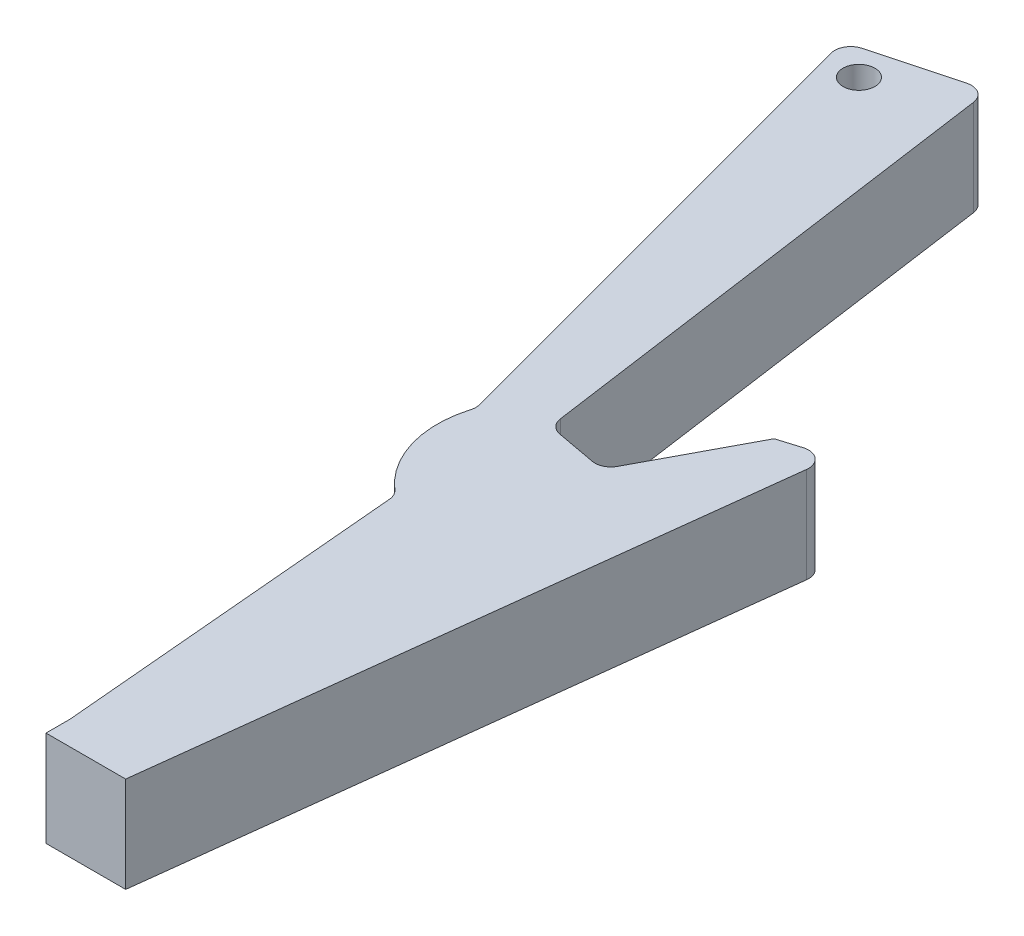
ISO-10303-21;
HEADER;
FILE_DESCRIPTION(('STEP AP214'),'2;1');
FILE_NAME('part.step','',(''),(''),'','','');
FILE_SCHEMA(('AUTOMOTIVE_DESIGN { 1 0 10303 214 1 1 1 1 }'));
ENDSEC;
DATA;
#1=APPLICATION_CONTEXT('core data for automotive mechanical design processes');
#2=APPLICATION_PROTOCOL_DEFINITION('international standard','automotive_design',2000,#1);
#3=PRODUCT_CONTEXT('',#1,'mechanical');
#4=PRODUCT('Part','Part','',(#3));
#5=PRODUCT_RELATED_PRODUCT_CATEGORY('part','',(#4));
#6=PRODUCT_DEFINITION_FORMATION('','',#4);
#7=PRODUCT_DEFINITION_CONTEXT('part definition',#1,'design');
#8=PRODUCT_DEFINITION('design','',#6,#7);
#9=PRODUCT_DEFINITION_SHAPE('','',#8);
#10=(LENGTH_UNIT() NAMED_UNIT(*) SI_UNIT(.MILLI.,.METRE.));
#11=(NAMED_UNIT(*) PLANE_ANGLE_UNIT() SI_UNIT($,.RADIAN.));
#12=(NAMED_UNIT(*) SI_UNIT($,.STERADIAN.) SOLID_ANGLE_UNIT());
#13=UNCERTAINTY_MEASURE_WITH_UNIT(LENGTH_MEASURE(1.E-05),#10,'distance_accuracy_value','');
#14=(GEOMETRIC_REPRESENTATION_CONTEXT(3) GLOBAL_UNCERTAINTY_ASSIGNED_CONTEXT((#13)) GLOBAL_UNIT_ASSIGNED_CONTEXT((#10,
#11,#12)) REPRESENTATION_CONTEXT('',''));
#15=CARTESIAN_POINT('',(0.,0.,0.));
#16=DIRECTION('',(0.,0.,1.));
#17=DIRECTION('',(1.,0.,0.));
#18=AXIS2_PLACEMENT_3D('',#15,#16,#17);
#19=CARTESIAN_POINT('',(-2.65349144547683,12.,-44.5765718956175));
#20=DIRECTION('',(-0.99026806874157,0.,0.13917310096007));
#21=DIRECTION('',(0.13917310096007,0.,0.99026806874157));
#22=AXIS2_PLACEMENT_3D('',#19,#20,#21);
#23=PLANE('',#22);
#24=DIRECTION('',(-0.13917310096007,0.,-0.99026806874157));
#25=VECTOR('',#24,1.);
#26=CARTESIAN_POINT('',(-2.65349144547683,12.,-44.5765718956175));
#27=LINE('',#26,#25);
#28=CARTESIAN_POINT('',(6.1405419291194,12.,17.9962269156188));
#29=VERTEX_POINT('',#28);
#30=CARTESIAN_POINT('',(-2.33887829598138,12.,-42.3379830174337));
#31=VERTEX_POINT('',#30);
#32=EDGE_CURVE('E265',#29,#31,#27,.T.);
#33=ORIENTED_EDGE('',*,*,#32,.F.);
#34=DIRECTION('',(0.,-1.,0.));
#35=VECTOR('',#34,1.);
#36=CARTESIAN_POINT('',(6.1405419291194,0.,17.9962269156188));
#37=LINE('',#36,#35);
#38=CARTESIAN_POINT('',(6.1405419291194,0.,17.9962269156188));
#39=VERTEX_POINT('',#38);
#40=EDGE_CURVE('E294',#29,#39,#37,.T.);
#41=ORIENTED_EDGE('',*,*,#40,.T.);
#42=DIRECTION('',(-0.13917310096007,0.,-0.99026806874157));
#43=VECTOR('',#42,1.);
#44=CARTESIAN_POINT('',(-2.65349144547683,0.,-44.5765718956175));
#45=LINE('',#44,#43);
#46=CARTESIAN_POINT('',(-2.33887829598138,0.,-42.3379830174337));
#47=VERTEX_POINT('',#46);
#48=EDGE_CURVE('E226',#39,#47,#45,.T.);
#49=ORIENTED_EDGE('',*,*,#48,.T.);
#50=DIRECTION('',(0.,-1.,0.));
#51=VECTOR('',#50,1.);
#52=CARTESIAN_POINT('',(-2.33887829598138,12.,-42.3379830174337));
#53=LINE('',#52,#51);
#54=EDGE_CURVE('E291',#47,#31,#53,.F.);
#55=ORIENTED_EDGE('',*,*,#54,.T.);
#56=EDGE_LOOP('',(#33,#41,#49,#55));
#57=FACE_BOUND('',#56,.T.);
#58=ADVANCED_FACE('F49',(#57),#23,.F.);
#59=CARTESIAN_POINT('',(-2.65349144547683,12.,-44.5765718956175));
#60=DIRECTION('',(0.258819045102521,0.,0.965925826289068));
#61=DIRECTION('',(0.965925826289068,0.,-0.258819045102521));
#62=AXIS2_PLACEMENT_3D('',#59,#60,#61);
#63=PLANE('',#62);
#64=DIRECTION('',(-0.965925826289068,0.,0.258819045102521));
#65=VECTOR('',#64,1.);
#66=CARTESIAN_POINT('',(-2.65349144547683,12.,-44.5765718956175));
#67=LINE('',#66,#65);
#68=CARTESIAN_POINT('',(-4.83705252366957,12.,-43.9914884680917));
#69=VERTEX_POINT('',#68);
#70=CARTESIAN_POINT('',(-15.2105271872347,12.,-41.2119243092847));
#71=VERTEX_POINT('',#70);
#72=EDGE_CURVE('E382',#69,#71,#67,.T.);
#73=ORIENTED_EDGE('',*,*,#72,.F.);
#74=DIRECTION('',(0.,-1.,0.));
#75=VECTOR('',#74,1.);
#76=CARTESIAN_POINT('',(-4.83705252366957,12.,-43.9914884680917));
#77=LINE('',#76,#75);
#78=CARTESIAN_POINT('',(-4.83705252366957,0.,-43.9914884680917));
#79=VERTEX_POINT('',#78);
#80=EDGE_CURVE('E334',#69,#79,#77,.T.);
#81=ORIENTED_EDGE('',*,*,#80,.T.);
#82=DIRECTION('',(-0.965925826289068,0.,0.258819045102521));
#83=VECTOR('',#82,1.);
#84=CARTESIAN_POINT('',(-2.65349144547683,0.,-44.5765718956175));
#85=LINE('',#84,#83);
#86=CARTESIAN_POINT('',(-15.2105271872347,0.,-41.2119243092847));
#87=VERTEX_POINT('',#86);
#88=EDGE_CURVE('E230',#79,#87,#85,.T.);
#89=ORIENTED_EDGE('',*,*,#88,.T.);
#90=DIRECTION('',(0.,-1.,0.));
#91=VECTOR('',#90,1.);
#92=CARTESIAN_POINT('',(-15.2105271872347,12.,-41.2119243092847));
#93=LINE('',#92,#91);
#94=EDGE_CURVE('E65',#87,#71,#93,.F.);
#95=ORIENTED_EDGE('',*,*,#94,.T.);
#96=EDGE_LOOP('',(#73,#81,#89,#95));
#97=FACE_BOUND('',#96,.T.);
#98=ADVANCED_FACE('F427',(#97),#63,.F.);
#99=CARTESIAN_POINT('',(-17.1423788398128,12.,-40.6942862190796));
#100=DIRECTION('',(0.965925826289067,0.,-0.258819045102525));
#101=DIRECTION('',(-0.258819045102525,0.,-0.965925826289067));
#102=AXIS2_PLACEMENT_3D('',#99,#100,#101);
#103=PLANE('',#102);
#104=DIRECTION('',(0.258819045102525,0.,0.965925826289067));
#105=VECTOR('',#104,1.);
#106=CARTESIAN_POINT('',(-17.1423788398128,0.,-40.6942862190796));
#107=LINE('',#106,#105);
#108=CARTESIAN_POINT('',(-16.6247407496078,0.,-38.7624345665015));
#109=VERTEX_POINT('',#108);
#110=CARTESIAN_POINT('',(-0.470359644799433,0.,21.5265364814728));
#111=VERTEX_POINT('',#110);
#112=EDGE_CURVE('E234',#109,#111,#107,.T.);
#113=ORIENTED_EDGE('',*,*,#112,.T.);
#114=DIRECTION('',(0.,1.,0.));
#115=VECTOR('',#114,1.);
#116=CARTESIAN_POINT('',(-0.470359644799428,12.,21.5265364814729));
#117=LINE('',#116,#115);
#118=CARTESIAN_POINT('',(-0.470359644799433,12.,21.5265364814728));
#119=VERTEX_POINT('',#118);
#120=EDGE_CURVE('E288',#111,#119,#117,.T.);
#121=ORIENTED_EDGE('',*,*,#120,.T.);
#122=DIRECTION('',(0.258819045102525,0.,0.965925826289067));
#123=VECTOR('',#122,1.);
#124=CARTESIAN_POINT('',(-17.1423788398128,12.,-40.6942862190796));
#125=LINE('',#124,#123);
#126=CARTESIAN_POINT('',(-16.6247407496078,12.,-38.7624345665015));
#127=VERTEX_POINT('',#126);
#128=EDGE_CURVE('E385',#127,#119,#125,.T.);
#129=ORIENTED_EDGE('',*,*,#128,.F.);
#130=DIRECTION('',(0.,-1.,0.));
#131=VECTOR('',#130,1.);
#132=CARTESIAN_POINT('',(-16.6247407496078,12.,-38.7624345665015));
#133=LINE('',#132,#131);
#134=EDGE_CURVE('E284',#127,#109,#133,.T.);
#135=ORIENTED_EDGE('',*,*,#134,.T.);
#136=EDGE_LOOP('',(#113,#121,#129,#135));
#137=FACE_BOUND('',#136,.T.);
#138=ADVANCED_FACE('F432',(#137),#103,.F.);
#139=CARTESIAN_POINT('',(11.9864841455349,12.,26.2827407739579));
#140=DIRECTION('',(0.,-1.,0.));
#141=DIRECTION('',(0.,0.,-1.));
#142=AXIS2_PLACEMENT_3D('',#139,#140,#141);
#143=CYLINDRICAL_SURFACE('',#142,13.);
#144=CARTESIAN_POINT('',(11.9864841455349,0.,26.2827407739579));
#145=DIRECTION('',(0.,1.,0.));
#146=DIRECTION('',(0.,0.,1.));
#147=AXIS2_PLACEMENT_3D('',#144,#145,#146);
#148=CIRCLE('',#147,13.);
#149=CARTESIAN_POINT('',(-0.483718571655904,0.,22.6093167319819));
#150=VERTEX_POINT('',#149);
#151=CARTESIAN_POINT('',(3.47033842210722,0.,36.104922915282));
#152=VERTEX_POINT('',#151);
#153=EDGE_CURVE('E238',#150,#152,#148,.T.);
#154=ORIENTED_EDGE('',*,*,#153,.T.);
#155=DIRECTION('',(0.,-1.,0.));
#156=VECTOR('',#155,1.);
#157=CARTESIAN_POINT('',(3.47033842210722,12.,36.104922915282));
#158=LINE('',#157,#156);
#159=CARTESIAN_POINT('',(3.47033842210722,12.,36.104922915282));
#160=VERTEX_POINT('',#159);
#161=EDGE_CURVE('E281',#152,#160,#158,.F.);
#162=ORIENTED_EDGE('',*,*,#161,.T.);
#163=CARTESIAN_POINT('',(11.9864841455349,12.,26.2827407739579));
#164=DIRECTION('',(0.,1.,0.));
#165=DIRECTION('',(0.,0.,1.));
#166=AXIS2_PLACEMENT_3D('',#163,#164,#165);
#167=CIRCLE('',#166,13.);
#168=CARTESIAN_POINT('',(-0.483718571655904,12.,22.6093167319819));
#169=VERTEX_POINT('',#168);
#170=EDGE_CURVE('E188',#169,#160,#167,.T.);
#171=ORIENTED_EDGE('',*,*,#170,.F.);
#172=DIRECTION('',(0.,-1.,0.));
#173=VECTOR('',#172,1.);
#174=CARTESIAN_POINT('',(-0.483718571655906,12.,22.6093167319819));
#175=LINE('',#174,#173);
#176=EDGE_CURVE('E277',#169,#150,#175,.T.);
#177=ORIENTED_EDGE('',*,*,#176,.T.);
#178=EDGE_LOOP('',(#154,#162,#171,#177));
#179=FACE_BOUND('',#178,.T.);
#180=ADVANCED_FACE('F463',(#179),#143,.T.);
#181=CARTESIAN_POINT('',(8.01379514327857,12.,81.4286873610854));
#182=DIRECTION('',(0.996169325772287,0.,-0.0874452651113049));
#183=DIRECTION('',(-0.0874452651113049,0.,-0.996169325772288));
#184=AXIS2_PLACEMENT_3D('',#181,#182,#183);
#185=PLANE('',#184);
#186=DIRECTION('',(0.0874452651113049,0.,0.996169325772287));
#187=VECTOR('',#186,1.);
#188=CARTESIAN_POINT('',(8.01379514327857,12.,81.4286873610854));
#189=LINE('',#188,#187);
#190=CARTESIAN_POINT('',(4.15250080850908,12.,37.4411373298784));
#191=VERTEX_POINT('',#190);
#192=CARTESIAN_POINT('',(8.01379514327857,12.,81.4286873610854));
#193=VERTEX_POINT('',#192);
#194=EDGE_CURVE('E174',#191,#193,#189,.T.);
#195=ORIENTED_EDGE('',*,*,#194,.F.);
#196=DIRECTION('',(0.,1.,0.));
#197=VECTOR('',#196,1.);
#198=CARTESIAN_POINT('',(4.15250080850908,0.,37.4411373298784));
#199=LINE('',#198,#197);
#200=CARTESIAN_POINT('',(4.15250080850908,0.,37.4411373298784));
#201=VERTEX_POINT('',#200);
#202=EDGE_CURVE('E198',#191,#201,#199,.F.);
#203=ORIENTED_EDGE('',*,*,#202,.T.);
#204=DIRECTION('',(0.0874452651113049,0.,0.996169325772287));
#205=VECTOR('',#204,1.);
#206=CARTESIAN_POINT('',(8.01379514327857,0.,81.4286873610854));
#207=LINE('',#206,#205);
#208=CARTESIAN_POINT('',(8.01379514327857,0.,81.4286873610854));
#209=VERTEX_POINT('',#208);
#210=EDGE_CURVE('E194',#201,#209,#207,.T.);
#211=ORIENTED_EDGE('',*,*,#210,.T.);
#212=DIRECTION('',(0.,-1.,0.));
#213=VECTOR('',#212,1.);
#214=CARTESIAN_POINT('',(8.01379514327857,12.,81.4286873610854));
#215=LINE('',#214,#213);
#216=EDGE_CURVE('E191',#193,#209,#215,.T.);
#217=ORIENTED_EDGE('',*,*,#216,.F.);
#218=EDGE_LOOP('',(#195,#203,#211,#217));
#219=FACE_BOUND('',#218,.T.);
#220=ADVANCED_FACE('F192',(#219),#185,.F.);
#221=CARTESIAN_POINT('',(8.01379514327857,12.,84.4286873610854));
#222=DIRECTION('',(1.,0.,0.));
#223=DIRECTION('',(0.,0.,-1.));
#224=AXIS2_PLACEMENT_3D('',#221,#222,#223);
#225=PLANE('',#224);
#226=DIRECTION('',(0.,0.,1.));
#227=VECTOR('',#226,1.);
#228=CARTESIAN_POINT('',(8.01379514327857,0.,84.4286873610854));
#229=LINE('',#228,#227);
#230=CARTESIAN_POINT('',(8.01379514327857,0.,84.4286873610854));
#231=VERTEX_POINT('',#230);
#232=EDGE_CURVE('E244',#209,#231,#229,.T.);
#233=ORIENTED_EDGE('',*,*,#232,.T.);
#234=DIRECTION('',(0.,-1.,0.));
#235=VECTOR('',#234,1.);
#236=CARTESIAN_POINT('',(8.01379514327857,12.,84.4286873610854));
#237=LINE('',#236,#235);
#238=CARTESIAN_POINT('',(8.01379514327857,12.,84.4286873610854));
#239=VERTEX_POINT('',#238);
#240=EDGE_CURVE('E199',#239,#231,#237,.T.);
#241=ORIENTED_EDGE('',*,*,#240,.F.);
#242=DIRECTION('',(0.,0.,1.));
#243=VECTOR('',#242,1.);
#244=CARTESIAN_POINT('',(8.01379514327857,12.,84.4286873610854));
#245=LINE('',#244,#243);
#246=EDGE_CURVE('E179',#193,#239,#245,.T.);
#247=ORIENTED_EDGE('',*,*,#246,.F.);
#248=ORIENTED_EDGE('',*,*,#216,.T.);
#249=EDGE_LOOP('',(#233,#241,#247,#248));
#250=FACE_BOUND('',#249,.T.);
#251=ADVANCED_FACE('F201',(#250),#225,.F.);
#252=CARTESIAN_POINT('',(18.0137951432786,12.,84.4286873610854));
#253=DIRECTION('',(0.,0.,-1.));
#254=DIRECTION('',(-1.,0.,0.));
#255=AXIS2_PLACEMENT_3D('',#252,#253,#254);
#256=PLANE('',#255);
#257=DIRECTION('',(1.,0.,0.));
#258=VECTOR('',#257,1.);
#259=CARTESIAN_POINT('',(18.0137951432786,0.,84.4286873610854));
#260=LINE('',#259,#258);
#261=CARTESIAN_POINT('',(18.0137951432786,0.,84.4286873610854));
#262=VERTEX_POINT('',#261);
#263=EDGE_CURVE('E247',#231,#262,#260,.T.);
#264=ORIENTED_EDGE('',*,*,#263,.T.);
#265=DIRECTION('',(0.,-1.,0.));
#266=VECTOR('',#265,1.);
#267=CARTESIAN_POINT('',(18.0137951432786,12.,84.4286873610854));
#268=LINE('',#267,#266);
#269=CARTESIAN_POINT('',(18.0137951432786,12.,84.4286873610854));
#270=VERTEX_POINT('',#269);
#271=EDGE_CURVE('E269',#270,#262,#268,.T.);
#272=ORIENTED_EDGE('',*,*,#271,.F.);
#273=DIRECTION('',(1.,0.,0.));
#274=VECTOR('',#273,1.);
#275=CARTESIAN_POINT('',(18.0137951432786,12.,84.4286873610854));
#276=LINE('',#275,#274);
#277=EDGE_CURVE('E205',#239,#270,#276,.T.);
#278=ORIENTED_EDGE('',*,*,#277,.F.);
#279=ORIENTED_EDGE('',*,*,#240,.T.);
#280=EDGE_LOOP('',(#264,#272,#278,#279));
#281=FACE_BOUND('',#280,.T.);
#282=ADVANCED_FACE('F405',(#281),#256,.F.);
#283=CARTESIAN_POINT('',(27.4517414412394,12.,4.98735574034277));
#284=DIRECTION('',(-0.993016645259283,0.,-0.11797432872451));
#285=DIRECTION('',(-0.11797432872451,0.,0.993016645259283));
#286=AXIS2_PLACEMENT_3D('',#283,#284,#285);
#287=PLANE('',#286);
#288=DIRECTION('',(0.11797432872451,0.,-0.993016645259283));
#289=VECTOR('',#288,1.);
#290=CARTESIAN_POINT('',(27.4517414412394,0.,4.98735574034277));
#291=LINE('',#290,#289);
#292=CARTESIAN_POINT('',(27.0898145393669,0.,8.03377644739096));
#293=VERTEX_POINT('',#292);
#294=EDGE_CURVE('E250',#262,#293,#291,.T.);
#295=ORIENTED_EDGE('',*,*,#294,.T.);
#296=DIRECTION('',(0.,-1.,0.));
#297=VECTOR('',#296,1.);
#298=CARTESIAN_POINT('',(27.0898145393669,12.,8.03377644739096));
#299=LINE('',#298,#297);
#300=CARTESIAN_POINT('',(27.0898145393669,12.,8.03377644739096));
#301=VERTEX_POINT('',#300);
#302=EDGE_CURVE('E321',#293,#301,#299,.F.);
#303=ORIENTED_EDGE('',*,*,#302,.T.);
#304=DIRECTION('',(0.11797432872451,0.,-0.993016645259283));
#305=VECTOR('',#304,1.);
#306=CARTESIAN_POINT('',(27.4517414412394,12.,4.98735574034277));
#307=LINE('',#306,#305);
#308=EDGE_CURVE('E208',#270,#301,#307,.T.);
#309=ORIENTED_EDGE('',*,*,#308,.F.);
#310=ORIENTED_EDGE('',*,*,#271,.T.);
#311=EDGE_LOOP('',(#295,#303,#309,#310));
#312=FACE_BOUND('',#311,.T.);
#313=ADVANCED_FACE('F417',(#312),#287,.F.);
#314=CARTESIAN_POINT('',(21.7145942594851,12.,6.74381303128064));
#315=DIRECTION('',(0.292742881822979,0.,0.956191196959048));
#316=DIRECTION('',(0.956191196959048,0.,-0.292742881822979));
#317=AXIS2_PLACEMENT_3D('',#314,#315,#316);
#318=PLANE('',#317);
#319=DIRECTION('',(-0.956191196959048,0.,0.292742881822979));
#320=VECTOR('',#319,1.);
#321=CARTESIAN_POINT('',(21.7145942594851,12.,6.74381303128064));
#322=LINE('',#321,#320);
#323=CARTESIAN_POINT('',(24.5182954852024,12.,5.88544539602384));
#324=VERTEX_POINT('',#323);
#325=CARTESIAN_POINT('',(21.7145942594851,12.,6.74381303128064));
#326=VERTEX_POINT('',#325);
#327=EDGE_CURVE('E214',#324,#326,#322,.T.);
#328=ORIENTED_EDGE('',*,*,#327,.F.);
#329=DIRECTION('',(0.,-1.,0.));
#330=VECTOR('',#329,1.);
#331=CARTESIAN_POINT('',(24.5182954852024,12.,5.88544539602384));
#332=LINE('',#331,#330);
#333=CARTESIAN_POINT('',(24.5182954852024,0.,5.88544539602384));
#334=VERTEX_POINT('',#333);
#335=EDGE_CURVE('E308',#324,#334,#332,.T.);
#336=ORIENTED_EDGE('',*,*,#335,.T.);
#337=DIRECTION('',(-0.956191196959048,0.,0.292742881822979));
#338=VECTOR('',#337,1.);
#339=CARTESIAN_POINT('',(21.7145942594851,0.,6.74381303128064));
#340=LINE('',#339,#338);
#341=CARTESIAN_POINT('',(21.7145942594851,0.,6.74381303128064));
#342=VERTEX_POINT('',#341);
#343=EDGE_CURVE('E254',#334,#342,#340,.T.);
#344=ORIENTED_EDGE('',*,*,#343,.T.);
#345=DIRECTION('',(0.,-1.,0.));
#346=VECTOR('',#345,1.);
#347=CARTESIAN_POINT('',(21.7145942594851,12.,6.74381303128064));
#348=LINE('',#347,#346);
#349=EDGE_CURVE('E225',#326,#342,#348,.T.);
#350=ORIENTED_EDGE('',*,*,#349,.F.);
#351=EDGE_LOOP('',(#328,#336,#344,#350));
#352=FACE_BOUND('',#351,.T.);
#353=ADVANCED_FACE('F416',(#352),#318,.F.);
#354=CARTESIAN_POINT('',(14.2085334178928,12.,20.8738891330685));
#355=DIRECTION('',(0.883129756361739,0.,0.469128802599515));
#356=DIRECTION('',(0.469128802599515,0.,-0.88312975636174));
#357=AXIS2_PLACEMENT_3D('',#354,#355,#356);
#358=PLANE('',#357);
#359=DIRECTION('',(-0.469128802599515,0.,0.883129756361739));
#360=VECTOR('',#359,1.);
#361=CARTESIAN_POINT('',(14.2085334178928,0.,20.8738891330685));
#362=LINE('',#361,#360);
#363=CARTESIAN_POINT('',(14.8960917627071,0.,19.5795681914087));
#364=VERTEX_POINT('',#363);
#365=EDGE_CURVE('E257',#342,#364,#362,.T.);
#366=ORIENTED_EDGE('',*,*,#365,.T.);
#367=DIRECTION('',(0.,-1.,0.));
#368=VECTOR('',#367,1.);
#369=CARTESIAN_POINT('',(14.8960917627071,12.,19.5795681914087));
#370=LINE('',#369,#368);
#371=CARTESIAN_POINT('',(14.8960917627071,12.,19.5795681914087));
#372=VERTEX_POINT('',#371);
#373=EDGE_CURVE('E305',#364,#372,#370,.F.);
#374=ORIENTED_EDGE('',*,*,#373,.T.);
#375=DIRECTION('',(-0.469128802599515,0.,0.883129756361739));
#376=VECTOR('',#375,1.);
#377=CARTESIAN_POINT('',(14.2085334178928,12.,20.8738891330685));
#378=LINE('',#377,#376);
#379=EDGE_CURVE('E217',#326,#372,#378,.T.);
#380=ORIENTED_EDGE('',*,*,#379,.F.);
#381=ORIENTED_EDGE('',*,*,#349,.T.);
#382=EDGE_LOOP('',(#366,#374,#380,#381));
#383=FACE_BOUND('',#382,.T.);
#384=ADVANCED_FACE('F364',(#383),#358,.F.);
#385=CARTESIAN_POINT('',(6.3411219754765,12.,19.4234281043825));
#386=DIRECTION('',(-0.181307628585742,0.,0.983426430302041));
#387=DIRECTION('',(0.983426430302041,0.,0.181307628585742));
#388=AXIS2_PLACEMENT_3D('',#385,#386,#387);
#389=PLANE('',#388);
#390=DIRECTION('',(-0.983426430302041,0.,-0.181307628585742));
#391=VECTOR('',#390,1.);
#392=CARTESIAN_POINT('',(6.3411219754765,0.,19.4234281043825));
#393=LINE('',#392,#391);
#394=CARTESIAN_POINT('',(12.7672169928122,0.,20.6081634468137));
#395=VERTEX_POINT('',#394);
#396=CARTESIAN_POINT('',(7.75846280943105,0.,19.6847335743028));
#397=VERTEX_POINT('',#396);
#398=EDGE_CURVE('E261',#395,#397,#393,.T.);
#399=ORIENTED_EDGE('',*,*,#398,.T.);
#400=DIRECTION('',(0.,-1.,0.));
#401=VECTOR('',#400,1.);
#402=CARTESIAN_POINT('',(7.75846280943105,12.,19.6847335743028));
#403=LINE('',#402,#401);
#404=CARTESIAN_POINT('',(7.75846280943105,12.,19.6847335743028));
#405=VERTEX_POINT('',#404);
#406=EDGE_CURVE('E302',#397,#405,#403,.F.);
#407=ORIENTED_EDGE('',*,*,#406,.T.);
#408=DIRECTION('',(-0.983426430302041,0.,-0.181307628585742));
#409=VECTOR('',#408,1.);
#410=CARTESIAN_POINT('',(6.3411219754765,12.,19.4234281043825));
#411=LINE('',#410,#409);
#412=CARTESIAN_POINT('',(12.7672169928122,12.,20.6081634468137));
#413=VERTEX_POINT('',#412);
#414=EDGE_CURVE('E221',#413,#405,#411,.T.);
#415=ORIENTED_EDGE('',*,*,#414,.F.);
#416=DIRECTION('',(0.,-1.,0.));
#417=VECTOR('',#416,1.);
#418=CARTESIAN_POINT('',(12.7672169928122,0.,20.6081634468137));
#419=LINE('',#418,#417);
#420=EDGE_CURVE('E298',#413,#395,#419,.T.);
#421=ORIENTED_EDGE('',*,*,#420,.T.);
#422=EDGE_LOOP('',(#399,#407,#415,#421));
#423=FACE_BOUND('',#422,.T.);
#424=ADVANCED_FACE('F372',(#423),#389,.F.);
#425=CARTESIAN_POINT('',(11.9864841455349,12.,26.2827407739579));
#426=DIRECTION('',(0.,1.,0.));
#427=DIRECTION('',(0.,0.,1.));
#428=AXIS2_PLACEMENT_3D('',#425,#426,#427);
#429=PLANE('',#428);
#430=CARTESIAN_POINT('',(-12.2433993542465,12.,-37.8658590943335));
#431=DIRECTION('',(0.,1.,0.));
#432=DIRECTION('',(0.,0.,1.));
#433=AXIS2_PLACEMENT_3D('',#430,#431,#432);
#434=CIRCLE('',#433,2.);
#435=CARTESIAN_POINT('',(-12.2433993542465,12.,-35.8658590943335));
#436=VERTEX_POINT('',#435);
#437=EDGE_CURVE('E388',#436,#436,#434,.T.);
#438=ORIENTED_EDGE('',*,*,#437,.F.);
#439=EDGE_LOOP('',(#438));
#440=FACE_BOUND('',#439,.T.);
#441=ORIENTED_EDGE('',*,*,#308,.T.);
#442=CARTESIAN_POINT('',(25.1037812488484,12.,7.79782778994194));
#443=DIRECTION('',(0.,1.,0.));
#444=DIRECTION('',(0.,0.,1.));
#445=AXIS2_PLACEMENT_3D('',#442,#443,#444);
#446=CIRCLE('',#445,2.);
#447=EDGE_CURVE('E329',#301,#324,#446,.T.);
#448=ORIENTED_EDGE('',*,*,#447,.T.);
#449=ORIENTED_EDGE('',*,*,#327,.T.);
#450=ORIENTED_EDGE('',*,*,#379,.T.);
#451=CARTESIAN_POINT('',(13.1298322499837,12.,18.6413105862097));
#452=DIRECTION('',(0.,1.,0.));
#453=DIRECTION('',(0.,0.,1.));
#454=AXIS2_PLACEMENT_3D('',#451,#452,#453);
#455=CIRCLE('',#454,2.);
#456=EDGE_CURVE('E11',#372,#413,#455,.F.);
#457=ORIENTED_EDGE('',*,*,#456,.T.);
#458=ORIENTED_EDGE('',*,*,#414,.T.);
#459=CARTESIAN_POINT('',(8.12107806660253,12.,17.7178807136987));
#460=DIRECTION('',(0.,1.,0.));
#461=DIRECTION('',(0.,0.,1.));
#462=AXIS2_PLACEMENT_3D('',#459,#460,#461);
#463=CIRCLE('',#462,2.);
#464=EDGE_CURVE('E352',#405,#29,#463,.F.);
#465=ORIENTED_EDGE('',*,*,#464,.T.);
#466=ORIENTED_EDGE('',*,*,#32,.T.);
#467=CARTESIAN_POINT('',(-4.31941443346452,12.,-42.0596368155135));
#468=DIRECTION('',(0.,1.,0.));
#469=DIRECTION('',(0.,0.,1.));
#470=AXIS2_PLACEMENT_3D('',#467,#468,#469);
#471=CIRCLE('',#470,2.);
#472=EDGE_CURVE('E72',#31,#69,#471,.T.);
#473=ORIENTED_EDGE('',*,*,#472,.T.);
#474=ORIENTED_EDGE('',*,*,#72,.T.);
#475=CARTESIAN_POINT('',(-14.6928890970297,12.,-39.2800726567066));
#476=DIRECTION('',(0.,1.,0.));
#477=DIRECTION('',(0.,0.,1.));
#478=AXIS2_PLACEMENT_3D('',#475,#476,#477);
#479=CIRCLE('',#478,2.);
#480=EDGE_CURVE('E324',#71,#127,#479,.T.);
#481=ORIENTED_EDGE('',*,*,#480,.T.);
#482=ORIENTED_EDGE('',*,*,#128,.T.);
#483=CARTESIAN_POINT('',(-2.40221129737757,12.,22.0441745716779));
#484=DIRECTION('',(0.,1.,0.));
#485=DIRECTION('',(0.,0.,1.));
#486=AXIS2_PLACEMENT_3D('',#483,#484,#485);
#487=CIRCLE('',#486,2.);
#488=EDGE_CURVE('E346',#119,#169,#487,.F.);
#489=ORIENTED_EDGE('',*,*,#488,.T.);
#490=ORIENTED_EDGE('',*,*,#170,.T.);
#491=CARTESIAN_POINT('',(2.1601621569645,12.,37.616027860101));
#492=DIRECTION('',(0.,1.,0.));
#493=DIRECTION('',(0.,0.,1.));
#494=AXIS2_PLACEMENT_3D('',#491,#492,#493);
#495=CIRCLE('',#494,2.);
#496=EDGE_CURVE('E183',#160,#191,#495,.F.);
#497=ORIENTED_EDGE('',*,*,#496,.T.);
#498=ORIENTED_EDGE('',*,*,#194,.T.);
#499=ORIENTED_EDGE('',*,*,#246,.T.);
#500=ORIENTED_EDGE('',*,*,#277,.T.);
#501=EDGE_LOOP('',(#441,#448,#449,#450,#457,#458,#465,#466,#473,#474,#481,#482,#489,#490,#497,
#498,#499,#500));
#502=FACE_BOUND('',#501,.T.);
#503=ADVANCED_FACE('F177',(#440,#502),#429,.T.);
#504=CARTESIAN_POINT('',(11.9864841455349,0.,26.2827407739579));
#505=DIRECTION('',(0.,1.,0.));
#506=DIRECTION('',(0.,0.,1.));
#507=AXIS2_PLACEMENT_3D('',#504,#505,#506);
#508=PLANE('',#507);
#509=CARTESIAN_POINT('',(-12.2433993542465,0.,-37.8658590943335));
#510=DIRECTION('',(0.,1.,0.));
#511=DIRECTION('',(0.,0.,1.));
#512=AXIS2_PLACEMENT_3D('',#509,#510,#511);
#513=CIRCLE('',#512,2.);
#514=CARTESIAN_POINT('',(-12.2433993542465,0.,-35.8658590943335));
#515=VERTEX_POINT('',#514);
#516=EDGE_CURVE('E231',#515,#515,#513,.T.);
#517=ORIENTED_EDGE('',*,*,#516,.T.);
#518=EDGE_LOOP('',(#517));
#519=FACE_BOUND('',#518,.T.);
#520=ORIENTED_EDGE('',*,*,#343,.F.);
#521=CARTESIAN_POINT('',(25.1037812488484,0.,7.79782778994194));
#522=DIRECTION('',(0.,1.,0.));
#523=DIRECTION('',(0.,0.,1.));
#524=AXIS2_PLACEMENT_3D('',#521,#522,#523);
#525=CIRCLE('',#524,2.);
#526=EDGE_CURVE('E318',#334,#293,#525,.F.);
#527=ORIENTED_EDGE('',*,*,#526,.T.);
#528=ORIENTED_EDGE('',*,*,#294,.F.);
#529=ORIENTED_EDGE('',*,*,#263,.F.);
#530=ORIENTED_EDGE('',*,*,#232,.F.);
#531=ORIENTED_EDGE('',*,*,#210,.F.);
#532=CARTESIAN_POINT('',(2.1601621569645,0.,37.616027860101));
#533=DIRECTION('',(0.,1.,0.));
#534=DIRECTION('',(0.,0.,1.));
#535=AXIS2_PLACEMENT_3D('',#532,#533,#534);
#536=CIRCLE('',#535,2.);
#537=EDGE_CURVE('E338',#201,#152,#536,.T.);
#538=ORIENTED_EDGE('',*,*,#537,.T.);
#539=ORIENTED_EDGE('',*,*,#153,.F.);
#540=CARTESIAN_POINT('',(-2.40221129737757,0.,22.0441745716779));
#541=DIRECTION('',(0.,1.,0.));
#542=DIRECTION('',(0.,0.,1.));
#543=AXIS2_PLACEMENT_3D('',#540,#541,#542);
#544=CIRCLE('',#543,2.);
#545=EDGE_CURVE('E343',#150,#111,#544,.T.);
#546=ORIENTED_EDGE('',*,*,#545,.T.);
#547=ORIENTED_EDGE('',*,*,#112,.F.);
#548=CARTESIAN_POINT('',(-14.6928890970297,0.,-39.2800726567066));
#549=DIRECTION('',(0.,1.,0.));
#550=DIRECTION('',(0.,0.,1.));
#551=AXIS2_PLACEMENT_3D('',#548,#549,#550);
#552=CIRCLE('',#551,2.);
#553=EDGE_CURVE('E312',#109,#87,#552,.F.);
#554=ORIENTED_EDGE('',*,*,#553,.T.);
#555=ORIENTED_EDGE('',*,*,#88,.F.);
#556=CARTESIAN_POINT('',(-4.31941443346452,0.,-42.0596368155135));
#557=DIRECTION('',(0.,1.,0.));
#558=DIRECTION('',(0.,0.,1.));
#559=AXIS2_PLACEMENT_3D('',#556,#557,#558);
#560=CIRCLE('',#559,2.);
#561=EDGE_CURVE('E315',#79,#47,#560,.F.);
#562=ORIENTED_EDGE('',*,*,#561,.T.);
#563=ORIENTED_EDGE('',*,*,#48,.F.);
#564=CARTESIAN_POINT('',(8.12107806660253,0.,17.7178807136987));
#565=DIRECTION('',(0.,1.,0.));
#566=DIRECTION('',(0.,0.,1.));
#567=AXIS2_PLACEMENT_3D('',#564,#565,#566);
#568=CIRCLE('',#567,2.);
#569=EDGE_CURVE('E349',#39,#397,#568,.T.);
#570=ORIENTED_EDGE('',*,*,#569,.T.);
#571=ORIENTED_EDGE('',*,*,#398,.F.);
#572=CARTESIAN_POINT('',(13.1298322499837,0.,18.6413105862097));
#573=DIRECTION('',(0.,1.,0.));
#574=DIRECTION('',(0.,0.,1.));
#575=AXIS2_PLACEMENT_3D('',#572,#573,#574);
#576=CIRCLE('',#575,2.);
#577=EDGE_CURVE('E58',#395,#364,#576,.T.);
#578=ORIENTED_EDGE('',*,*,#577,.T.);
#579=ORIENTED_EDGE('',*,*,#365,.F.);
#580=EDGE_LOOP('',(#520,#527,#528,#529,#530,#531,#538,#539,#546,#547,#554,#555,#562,#563,#570,
#571,#578,#579));
#581=FACE_BOUND('',#580,.T.);
#582=ADVANCED_FACE('F359',(#519,#581),#508,.F.);
#583=CARTESIAN_POINT('',(-12.2433993542465,0.,-37.8658590943335));
#584=DIRECTION('',(0.,1.,0.));
#585=DIRECTION('',(0.,0.,1.));
#586=AXIS2_PLACEMENT_3D('',#583,#584,#585);
#587=CYLINDRICAL_SURFACE('',#586,2.);
#588=ORIENTED_EDGE('',*,*,#516,.F.);
#589=EDGE_LOOP('',(#588));
#590=FACE_BOUND('',#589,.T.);
#591=ORIENTED_EDGE('',*,*,#437,.T.);
#592=EDGE_LOOP('',(#591));
#593=FACE_BOUND('',#592,.T.);
#594=ADVANCED_FACE('F439',(#590,#593),#587,.F.);
#595=CARTESIAN_POINT('',(2.1601621569645,12.,37.616027860101));
#596=DIRECTION('',(0.,-1.,0.));
#597=DIRECTION('',(0.,0.,-1.));
#598=AXIS2_PLACEMENT_3D('',#595,#596,#597);
#599=CYLINDRICAL_SURFACE('',#598,2.);
#600=ORIENTED_EDGE('',*,*,#496,.F.);
#601=ORIENTED_EDGE('',*,*,#161,.F.);
#602=ORIENTED_EDGE('',*,*,#537,.F.);
#603=ORIENTED_EDGE('',*,*,#202,.F.);
#604=EDGE_LOOP('',(#600,#601,#602,#603));
#605=FACE_BOUND('',#604,.T.);
#606=ADVANCED_FACE('F400',(#605),#599,.F.);
#607=CARTESIAN_POINT('',(-2.40221129737757,12.,22.0441745716779));
#608=DIRECTION('',(0.,-1.,0.));
#609=DIRECTION('',(0.,0.,-1.));
#610=AXIS2_PLACEMENT_3D('',#607,#608,#609);
#611=CYLINDRICAL_SURFACE('',#610,2.);
#612=ORIENTED_EDGE('',*,*,#488,.F.);
#613=ORIENTED_EDGE('',*,*,#120,.F.);
#614=ORIENTED_EDGE('',*,*,#545,.F.);
#615=ORIENTED_EDGE('',*,*,#176,.F.);
#616=EDGE_LOOP('',(#612,#613,#614,#615));
#617=FACE_BOUND('',#616,.T.);
#618=ADVANCED_FACE('F438',(#617),#611,.F.);
#619=CARTESIAN_POINT('',(8.12107806660253,12.,17.7178807136987));
#620=DIRECTION('',(0.,1.,0.));
#621=DIRECTION('',(0.,0.,1.));
#622=AXIS2_PLACEMENT_3D('',#619,#620,#621);
#623=CYLINDRICAL_SURFACE('',#622,2.);
#624=ORIENTED_EDGE('',*,*,#464,.F.);
#625=ORIENTED_EDGE('',*,*,#406,.F.);
#626=ORIENTED_EDGE('',*,*,#569,.F.);
#627=ORIENTED_EDGE('',*,*,#40,.F.);
#628=EDGE_LOOP('',(#624,#625,#626,#627));
#629=FACE_BOUND('',#628,.T.);
#630=ADVANCED_FACE('F375',(#629),#623,.F.);
#631=CARTESIAN_POINT('',(13.1298322499837,12.,18.6413105862097));
#632=DIRECTION('',(0.,1.,0.));
#633=DIRECTION('',(0.,0.,1.));
#634=AXIS2_PLACEMENT_3D('',#631,#632,#633);
#635=CYLINDRICAL_SURFACE('',#634,2.);
#636=ORIENTED_EDGE('',*,*,#456,.F.);
#637=ORIENTED_EDGE('',*,*,#373,.F.);
#638=ORIENTED_EDGE('',*,*,#577,.F.);
#639=ORIENTED_EDGE('',*,*,#420,.F.);
#640=EDGE_LOOP('',(#636,#637,#638,#639));
#641=FACE_BOUND('',#640,.T.);
#642=ADVANCED_FACE('F368',(#641),#635,.F.);
#643=CARTESIAN_POINT('',(25.1037812488484,12.,7.79782778994194));
#644=DIRECTION('',(0.,-1.,0.));
#645=DIRECTION('',(0.,0.,-1.));
#646=AXIS2_PLACEMENT_3D('',#643,#644,#645);
#647=CYLINDRICAL_SURFACE('',#646,2.);
#648=ORIENTED_EDGE('',*,*,#447,.F.);
#649=ORIENTED_EDGE('',*,*,#302,.F.);
#650=ORIENTED_EDGE('',*,*,#526,.F.);
#651=ORIENTED_EDGE('',*,*,#335,.F.);
#652=EDGE_LOOP('',(#648,#649,#650,#651));
#653=FACE_BOUND('',#652,.T.);
#654=ADVANCED_FACE('F414',(#653),#647,.T.);
#655=CARTESIAN_POINT('',(-4.31941443346452,12.,-42.0596368155135));
#656=DIRECTION('',(0.,-1.,0.));
#657=DIRECTION('',(0.,0.,-1.));
#658=AXIS2_PLACEMENT_3D('',#655,#656,#657);
#659=CYLINDRICAL_SURFACE('',#658,2.);
#660=ORIENTED_EDGE('',*,*,#472,.F.);
#661=ORIENTED_EDGE('',*,*,#54,.F.);
#662=ORIENTED_EDGE('',*,*,#561,.F.);
#663=ORIENTED_EDGE('',*,*,#80,.F.);
#664=EDGE_LOOP('',(#660,#661,#662,#663));
#665=FACE_BOUND('',#664,.T.);
#666=ADVANCED_FACE('F448',(#665),#659,.T.);
#667=CARTESIAN_POINT('',(-14.6928890970297,12.,-39.2800726567066));
#668=DIRECTION('',(0.,-1.,0.));
#669=DIRECTION('',(0.,0.,-1.));
#670=AXIS2_PLACEMENT_3D('',#667,#668,#669);
#671=CYLINDRICAL_SURFACE('',#670,2.);
#672=ORIENTED_EDGE('',*,*,#480,.F.);
#673=ORIENTED_EDGE('',*,*,#94,.F.);
#674=ORIENTED_EDGE('',*,*,#553,.F.);
#675=ORIENTED_EDGE('',*,*,#134,.F.);
#676=EDGE_LOOP('',(#672,#673,#674,#675));
#677=FACE_BOUND('',#676,.T.);
#678=ADVANCED_FACE('F51',(#677),#671,.T.);
#679=CLOSED_SHELL('',(#58,#98,#138,#180,#220,#251,#282,#313,#353,#384,#424,#503,#582,#594,#606,
#618,#630,#642,#654,#666,#678));
#680=MANIFOLD_SOLID_BREP('B2',#679);
#681=ADVANCED_BREP_SHAPE_REPRESENTATION('',(#18,#680),#14);
#682=SHAPE_DEFINITION_REPRESENTATION(#9,#681);
ENDSEC;
END-ISO-10303-21;
